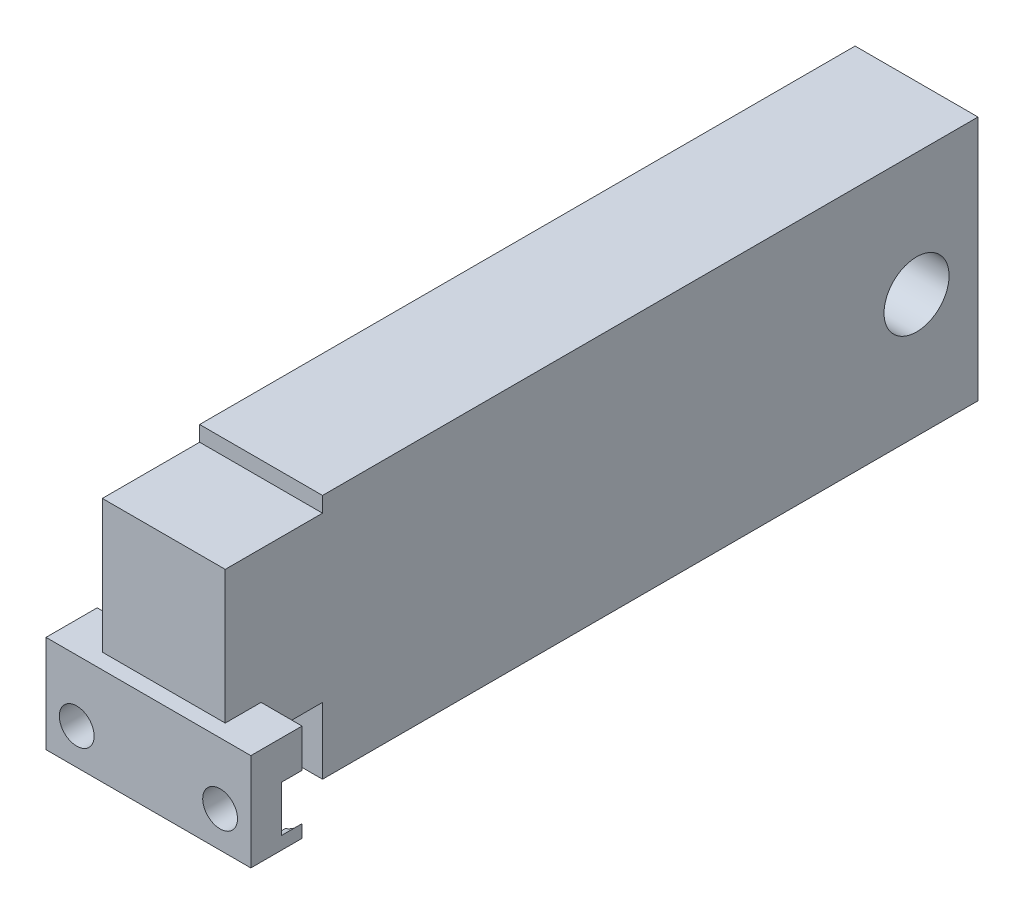
ISO-10303-21;
HEADER;
FILE_DESCRIPTION(('STEP AP214'),'2;1');
FILE_NAME('part.step','',(''),(''),'','','');
FILE_SCHEMA(('AUTOMOTIVE_DESIGN { 1 0 10303 214 1 1 1 1 }'));
ENDSEC;
DATA;
#1=APPLICATION_CONTEXT('core data for automotive mechanical design processes');
#2=APPLICATION_PROTOCOL_DEFINITION('international standard','automotive_design',2000,#1);
#3=PRODUCT_CONTEXT('',#1,'mechanical');
#4=PRODUCT('Part','Part','',(#3));
#5=PRODUCT_RELATED_PRODUCT_CATEGORY('part','',(#4));
#6=PRODUCT_DEFINITION_FORMATION('','',#4);
#7=PRODUCT_DEFINITION_CONTEXT('part definition',#1,'design');
#8=PRODUCT_DEFINITION('design','',#6,#7);
#9=PRODUCT_DEFINITION_SHAPE('','',#8);
#10=(LENGTH_UNIT() NAMED_UNIT(*) SI_UNIT(.MILLI.,.METRE.));
#11=(NAMED_UNIT(*) PLANE_ANGLE_UNIT() SI_UNIT($,.RADIAN.));
#12=(NAMED_UNIT(*) SI_UNIT($,.STERADIAN.) SOLID_ANGLE_UNIT());
#13=UNCERTAINTY_MEASURE_WITH_UNIT(LENGTH_MEASURE(1.E-05),#10,'distance_accuracy_value','');
#14=(GEOMETRIC_REPRESENTATION_CONTEXT(3) GLOBAL_UNCERTAINTY_ASSIGNED_CONTEXT((#13)) GLOBAL_UNIT_ASSIGNED_CONTEXT((#10,
#11,#12)) REPRESENTATION_CONTEXT('',''));
#15=CARTESIAN_POINT('',(0.,0.,0.));
#16=DIRECTION('',(0.,0.,1.));
#17=DIRECTION('',(1.,0.,0.));
#18=AXIS2_PLACEMENT_3D('',#15,#16,#17);
#19=CARTESIAN_POINT('',(0.,0.,-5.));
#20=DIRECTION('',(0.,0.,-1.));
#21=DIRECTION('',(-1.,0.,0.));
#22=AXIS2_PLACEMENT_3D('',#19,#20,#21);
#23=PLANE('',#22);
#24=CARTESIAN_POINT('',(-27.,28.,-5.));
#25=DIRECTION('',(0.,0.,-1.));
#26=DIRECTION('',(-1.,0.,0.));
#27=AXIS2_PLACEMENT_3D('',#24,#25,#26);
#28=CIRCLE('',#27,3.75);
#29=CARTESIAN_POINT('',(-30.,30.25,-5.));
#30=VERTEX_POINT('',#29);
#31=CARTESIAN_POINT('',(-26.,31.6142080737002,-5.));
#32=VERTEX_POINT('',#31);
#33=EDGE_CURVE('E57',#30,#32,#28,.T.);
#34=ORIENTED_EDGE('',*,*,#33,.F.);
#35=DIRECTION('',(0.,-1.,0.));
#36=VECTOR('',#35,1.);
#37=CARTESIAN_POINT('',(-30.,24.5,-5.));
#38=LINE('',#37,#36);
#39=CARTESIAN_POINT('',(-30.,34.,-5.));
#40=VERTEX_POINT('',#39);
#41=EDGE_CURVE('E317',#40,#30,#38,.T.);
#42=ORIENTED_EDGE('',*,*,#41,.F.);
#43=DIRECTION('',(-1.,0.,0.));
#44=VECTOR('',#43,1.);
#45=CARTESIAN_POINT('',(-30.,34.,-5.));
#46=LINE('',#45,#44);
#47=CARTESIAN_POINT('',(-26.,34.,-5.));
#48=VERTEX_POINT('',#47);
#49=EDGE_CURVE('E332',#48,#40,#46,.T.);
#50=ORIENTED_EDGE('',*,*,#49,.F.);
#51=DIRECTION('',(0.,-1.,0.));
#52=VECTOR('',#51,1.);
#53=CARTESIAN_POINT('',(-26.,0.,-5.));
#54=LINE('',#53,#52);
#55=EDGE_CURVE('E293',#48,#32,#54,.T.);
#56=ORIENTED_EDGE('',*,*,#55,.T.);
#57=EDGE_LOOP('',(#34,#42,#50,#56));
#58=FACE_BOUND('',#57,.T.);
#59=ADVANCED_FACE('F41',(#58),#23,.T.);
#60=CARTESIAN_POINT('',(-24.75,31.,-5.));
#61=VERTEX_POINT('',#60);
#62=CARTESIAN_POINT('',(-25.6537087982164,24.5,-5.));
#63=VERTEX_POINT('',#62);
#64=EDGE_CURVE('E239',#61,#63,#28,.T.);
#65=ORIENTED_EDGE('',*,*,#64,.F.);
#66=DIRECTION('',(1.,0.,0.));
#67=VECTOR('',#66,1.);
#68=CARTESIAN_POINT('',(-30.,31.,-5.));
#69=LINE('',#68,#67);
#70=CARTESIAN_POINT('',(-15.25,31.,-5.));
#71=VERTEX_POINT('',#70);
#72=EDGE_CURVE('E231',#61,#71,#69,.T.);
#73=ORIENTED_EDGE('',*,*,#72,.T.);
#74=CARTESIAN_POINT('',(-13.,28.,-5.));
#75=DIRECTION('',(0.,0.,-1.));
#76=DIRECTION('',(-1.,0.,0.));
#77=AXIS2_PLACEMENT_3D('',#74,#75,#76);
#78=CIRCLE('',#77,3.75);
#79=CARTESIAN_POINT('',(-14.3462912017836,24.5,-5.));
#80=VERTEX_POINT('',#79);
#81=EDGE_CURVE('E205',#80,#71,#78,.T.);
#82=ORIENTED_EDGE('',*,*,#81,.F.);
#83=DIRECTION('',(1.,0.,0.));
#84=VECTOR('',#83,1.);
#85=CARTESIAN_POINT('',(-30.,24.5,-5.));
#86=LINE('',#85,#84);
#87=EDGE_CURVE('E330',#63,#80,#86,.T.);
#88=ORIENTED_EDGE('',*,*,#87,.F.);
#89=EDGE_LOOP('',(#65,#73,#82,#88));
#90=FACE_BOUND('',#89,.T.);
#91=ADVANCED_FACE('F236',(#90),#23,.T.);
#92=CARTESIAN_POINT('',(-14.,31.6142080737002,-5.));
#93=VERTEX_POINT('',#92);
#94=CARTESIAN_POINT('',(-10.,30.25,-5.));
#95=VERTEX_POINT('',#94);
#96=EDGE_CURVE('E223',#93,#95,#78,.T.);
#97=ORIENTED_EDGE('',*,*,#96,.F.);
#98=DIRECTION('',(0.,1.,0.));
#99=VECTOR('',#98,1.);
#100=CARTESIAN_POINT('',(-14.,0.,-5.));
#101=LINE('',#100,#99);
#102=CARTESIAN_POINT('',(-14.,34.,-5.));
#103=VERTEX_POINT('',#102);
#104=EDGE_CURVE('E287',#93,#103,#101,.T.);
#105=ORIENTED_EDGE('',*,*,#104,.T.);
#106=CARTESIAN_POINT('',(-10.,34.,-5.));
#107=VERTEX_POINT('',#106);
#108=EDGE_CURVE('E315',#107,#103,#46,.T.);
#109=ORIENTED_EDGE('',*,*,#108,.F.);
#110=DIRECTION('',(0.,1.,0.));
#111=VECTOR('',#110,1.);
#112=CARTESIAN_POINT('',(-10.,24.5,-5.));
#113=LINE('',#112,#111);
#114=EDGE_CURVE('E326',#95,#107,#113,.T.);
#115=ORIENTED_EDGE('',*,*,#114,.F.);
#116=EDGE_LOOP('',(#97,#105,#109,#115));
#117=FACE_BOUND('',#116,.T.);
#118=ADVANCED_FACE('F417',(#117),#23,.T.);
#119=CARTESIAN_POINT('',(-10.,25.75,-5.));
#120=VERTEX_POINT('',#119);
#121=CARTESIAN_POINT('',(-11.6537087982164,24.5,-5.));
#122=VERTEX_POINT('',#121);
#123=EDGE_CURVE('E212',#120,#122,#78,.T.);
#124=ORIENTED_EDGE('',*,*,#123,.F.);
#125=CARTESIAN_POINT('',(-10.,24.5,-5.));
#126=VERTEX_POINT('',#125);
#127=EDGE_CURVE('E327',#126,#120,#113,.T.);
#128=ORIENTED_EDGE('',*,*,#127,.F.);
#129=EDGE_CURVE('E325',#122,#126,#86,.T.);
#130=ORIENTED_EDGE('',*,*,#129,.F.);
#131=EDGE_LOOP('',(#124,#128,#130));
#132=FACE_BOUND('',#131,.T.);
#133=ADVANCED_FACE('F496',(#132),#23,.T.);
#134=CARTESIAN_POINT('',(-27.,28.,0.));
#135=DIRECTION('',(0.,0.,-1.));
#136=DIRECTION('',(-1.,0.,0.));
#137=AXIS2_PLACEMENT_3D('',#134,#135,#136);
#138=CYLINDRICAL_SURFACE('',#137,1.7);
#139=CARTESIAN_POINT('',(-27.,28.,0.));
#140=DIRECTION('',(0.,0.,1.));
#141=DIRECTION('',(1.,0.,0.));
#142=AXIS2_PLACEMENT_3D('',#139,#140,#141);
#143=CIRCLE('',#142,1.7);
#144=CARTESIAN_POINT('',(-25.3,28.,0.));
#145=VERTEX_POINT('',#144);
#146=EDGE_CURVE('E302',#145,#145,#143,.T.);
#147=ORIENTED_EDGE('',*,*,#146,.T.);
#148=EDGE_LOOP('',(#147));
#149=FACE_BOUND('',#148,.T.);
#150=CARTESIAN_POINT('',(-27.,28.,-3.));
#151=DIRECTION('',(0.,0.,-1.));
#152=DIRECTION('',(-1.,0.,0.));
#153=AXIS2_PLACEMENT_3D('',#150,#151,#152);
#154=CIRCLE('',#153,1.7);
#155=CARTESIAN_POINT('',(-28.7,28.,-3.));
#156=VERTEX_POINT('',#155);
#157=EDGE_CURVE('E453',#156,#156,#154,.T.);
#158=ORIENTED_EDGE('',*,*,#157,.T.);
#159=EDGE_LOOP('',(#158));
#160=FACE_BOUND('',#159,.T.);
#161=ADVANCED_FACE('F530',(#149,#160),#138,.F.);
#162=CARTESIAN_POINT('',(-13.,28.,0.));
#163=DIRECTION('',(0.,0.,-1.));
#164=DIRECTION('',(-1.,0.,0.));
#165=AXIS2_PLACEMENT_3D('',#162,#163,#164);
#166=CYLINDRICAL_SURFACE('',#165,1.7);
#167=CARTESIAN_POINT('',(-13.,28.,0.));
#168=DIRECTION('',(0.,0.,1.));
#169=DIRECTION('',(1.,0.,0.));
#170=AXIS2_PLACEMENT_3D('',#167,#168,#169);
#171=CIRCLE('',#170,1.7);
#172=CARTESIAN_POINT('',(-11.3,28.,0.));
#173=VERTEX_POINT('',#172);
#174=EDGE_CURVE('E301',#173,#173,#171,.T.);
#175=ORIENTED_EDGE('',*,*,#174,.T.);
#176=EDGE_LOOP('',(#175));
#177=FACE_BOUND('',#176,.T.);
#178=CARTESIAN_POINT('',(-13.,28.,-3.));
#179=DIRECTION('',(0.,0.,-1.));
#180=DIRECTION('',(-1.,0.,0.));
#181=AXIS2_PLACEMENT_3D('',#178,#179,#180);
#182=CIRCLE('',#181,1.7);
#183=CARTESIAN_POINT('',(-14.7,28.,-3.));
#184=VERTEX_POINT('',#183);
#185=EDGE_CURVE('E448',#184,#184,#182,.T.);
#186=ORIENTED_EDGE('',*,*,#185,.T.);
#187=EDGE_LOOP('',(#186));
#188=FACE_BOUND('',#187,.T.);
#189=ADVANCED_FACE('F527',(#177,#188),#166,.F.);
#190=CARTESIAN_POINT('',(-30.,24.5,0.));
#191=DIRECTION('',(0.,1.,0.));
#192=DIRECTION('',(0.,0.,1.));
#193=AXIS2_PLACEMENT_3D('',#190,#191,#192);
#194=PLANE('',#193);
#195=DIRECTION('',(-1.,0.,0.));
#196=VECTOR('',#195,1.);
#197=CARTESIAN_POINT('',(-30.,24.5,-3.));
#198=LINE('',#197,#196);
#199=CARTESIAN_POINT('',(-25.6537087982164,24.5,-3.));
#200=VERTEX_POINT('',#199);
#201=CARTESIAN_POINT('',(-28.3462912017836,24.5,-3.));
#202=VERTEX_POINT('',#201);
#203=EDGE_CURVE('E242',#200,#202,#198,.T.);
#204=ORIENTED_EDGE('',*,*,#203,.F.);
#205=DIRECTION('',(0.,0.,-1.));
#206=VECTOR('',#205,1.);
#207=CARTESIAN_POINT('',(-25.6537087982164,24.5,-3.));
#208=LINE('',#207,#206);
#209=EDGE_CURVE('E446',#200,#63,#208,.T.);
#210=ORIENTED_EDGE('',*,*,#209,.T.);
#211=ORIENTED_EDGE('',*,*,#87,.T.);
#212=DIRECTION('',(0.,0.,-1.));
#213=VECTOR('',#212,1.);
#214=CARTESIAN_POINT('',(-14.3462912017836,24.5,-3.));
#215=LINE('',#214,#213);
#216=CARTESIAN_POINT('',(-14.3462912017836,24.5,-3.));
#217=VERTEX_POINT('',#216);
#218=EDGE_CURVE('E207',#80,#217,#215,.F.);
#219=ORIENTED_EDGE('',*,*,#218,.T.);
#220=DIRECTION('',(-1.,0.,0.));
#221=VECTOR('',#220,1.);
#222=CARTESIAN_POINT('',(-30.,24.5,-3.));
#223=LINE('',#222,#221);
#224=CARTESIAN_POINT('',(-11.6537087982164,24.5,-3.));
#225=VERTEX_POINT('',#224);
#226=EDGE_CURVE('E455',#225,#217,#223,.T.);
#227=ORIENTED_EDGE('',*,*,#226,.F.);
#228=DIRECTION('',(0.,0.,-1.));
#229=VECTOR('',#228,1.);
#230=CARTESIAN_POINT('',(-11.6537087982164,24.5,-3.));
#231=LINE('',#230,#229);
#232=EDGE_CURVE('E432',#225,#122,#231,.T.);
#233=ORIENTED_EDGE('',*,*,#232,.T.);
#234=ORIENTED_EDGE('',*,*,#129,.T.);
#235=DIRECTION('',(0.,0.,-1.));
#236=VECTOR('',#235,1.);
#237=CARTESIAN_POINT('',(-10.,24.5,0.));
#238=LINE('',#237,#236);
#239=CARTESIAN_POINT('',(-10.,24.5,0.));
#240=VERTEX_POINT('',#239);
#241=EDGE_CURVE('E338',#240,#126,#238,.T.);
#242=ORIENTED_EDGE('',*,*,#241,.F.);
#243=DIRECTION('',(1.,0.,0.));
#244=VECTOR('',#243,1.);
#245=CARTESIAN_POINT('',(-30.,24.5,0.));
#246=LINE('',#245,#244);
#247=CARTESIAN_POINT('',(-30.,24.5,0.));
#248=VERTEX_POINT('',#247);
#249=EDGE_CURVE('E313',#248,#240,#246,.T.);
#250=ORIENTED_EDGE('',*,*,#249,.F.);
#251=DIRECTION('',(0.,0.,-1.));
#252=VECTOR('',#251,1.);
#253=CARTESIAN_POINT('',(-30.,24.5,0.));
#254=LINE('',#253,#252);
#255=CARTESIAN_POINT('',(-30.,24.5,-5.));
#256=VERTEX_POINT('',#255);
#257=EDGE_CURVE('E345',#248,#256,#254,.T.);
#258=ORIENTED_EDGE('',*,*,#257,.T.);
#259=CARTESIAN_POINT('',(-28.3462912017836,24.5,-5.));
#260=VERTEX_POINT('',#259);
#261=EDGE_CURVE('E323',#256,#260,#86,.T.);
#262=ORIENTED_EDGE('',*,*,#261,.T.);
#263=DIRECTION('',(0.,0.,-1.));
#264=VECTOR('',#263,1.);
#265=CARTESIAN_POINT('',(-28.3462912017836,24.5,-3.));
#266=LINE('',#265,#264);
#267=EDGE_CURVE('E444',#260,#202,#266,.F.);
#268=ORIENTED_EDGE('',*,*,#267,.T.);
#269=EDGE_LOOP('',(#204,#210,#211,#219,#227,#233,#234,#242,#250,#258,#262,#268));
#270=FACE_BOUND('',#269,.T.);
#271=ADVANCED_FACE('F469',(#270),#194,.F.);
#272=CARTESIAN_POINT('',(-30.,25.75,-5.));
#273=VERTEX_POINT('',#272);
#274=EDGE_CURVE('E221',#260,#273,#28,.T.);
#275=ORIENTED_EDGE('',*,*,#274,.F.);
#276=ORIENTED_EDGE('',*,*,#261,.F.);
#277=EDGE_CURVE('E307',#273,#256,#38,.T.);
#278=ORIENTED_EDGE('',*,*,#277,.F.);
#279=EDGE_LOOP('',(#275,#276,#278));
#280=FACE_BOUND('',#279,.T.);
#281=ADVANCED_FACE('F474',(#280),#23,.T.);
#282=CARTESIAN_POINT('',(-30.,34.,0.));
#283=DIRECTION('',(0.,-1.,0.));
#284=DIRECTION('',(0.,0.,-1.));
#285=AXIS2_PLACEMENT_3D('',#282,#283,#284);
#286=PLANE('',#285);
#287=DIRECTION('',(0.,0.,1.));
#288=VECTOR('',#287,1.);
#289=CARTESIAN_POINT('',(-26.,34.,0.));
#290=LINE('',#289,#288);
#291=CARTESIAN_POINT('',(-26.,34.,-1.5));
#292=VERTEX_POINT('',#291);
#293=EDGE_CURVE('E297',#48,#292,#290,.T.);
#294=ORIENTED_EDGE('',*,*,#293,.F.);
#295=ORIENTED_EDGE('',*,*,#49,.T.);
#296=DIRECTION('',(0.,0.,-1.));
#297=VECTOR('',#296,1.);
#298=CARTESIAN_POINT('',(-30.,34.,0.));
#299=LINE('',#298,#297);
#300=CARTESIAN_POINT('',(-30.,34.,0.));
#301=VERTEX_POINT('',#300);
#302=EDGE_CURVE('E318',#301,#40,#299,.T.);
#303=ORIENTED_EDGE('',*,*,#302,.F.);
#304=DIRECTION('',(-1.,0.,0.));
#305=VECTOR('',#304,1.);
#306=CARTESIAN_POINT('',(-30.,34.,0.));
#307=LINE('',#306,#305);
#308=CARTESIAN_POINT('',(-10.,34.,0.));
#309=VERTEX_POINT('',#308);
#310=EDGE_CURVE('E316',#309,#301,#307,.T.);
#311=ORIENTED_EDGE('',*,*,#310,.F.);
#312=DIRECTION('',(0.,0.,-1.));
#313=VECTOR('',#312,1.);
#314=CARTESIAN_POINT('',(-10.,34.,0.));
#315=LINE('',#314,#313);
#316=EDGE_CURVE('E336',#309,#107,#315,.T.);
#317=ORIENTED_EDGE('',*,*,#316,.T.);
#318=ORIENTED_EDGE('',*,*,#108,.T.);
#319=DIRECTION('',(0.,0.,-1.));
#320=VECTOR('',#319,1.);
#321=CARTESIAN_POINT('',(-14.,34.,0.));
#322=LINE('',#321,#320);
#323=CARTESIAN_POINT('',(-14.,34.,-1.5));
#324=VERTEX_POINT('',#323);
#325=EDGE_CURVE('E295',#324,#103,#322,.T.);
#326=ORIENTED_EDGE('',*,*,#325,.F.);
#327=DIRECTION('',(1.,0.,0.));
#328=VECTOR('',#327,1.);
#329=CARTESIAN_POINT('',(-30.,34.,-1.5));
#330=LINE('',#329,#328);
#331=EDGE_CURVE('E290',#292,#324,#330,.T.);
#332=ORIENTED_EDGE('',*,*,#331,.F.);
#333=EDGE_LOOP('',(#294,#295,#303,#311,#317,#318,#326,#332));
#334=FACE_BOUND('',#333,.T.);
#335=ADVANCED_FACE('F411',(#334),#286,.F.);
#336=CARTESIAN_POINT('',(0.,0.,0.));
#337=DIRECTION('',(0.,0.,-1.));
#338=DIRECTION('',(-1.,0.,0.));
#339=AXIS2_PLACEMENT_3D('',#336,#337,#338);
#340=PLANE('',#339);
#341=DIRECTION('',(0.,-1.,0.));
#342=VECTOR('',#341,1.);
#343=CARTESIAN_POINT('',(-30.,24.5,0.));
#344=LINE('',#343,#342);
#345=EDGE_CURVE('E306',#301,#248,#344,.T.);
#346=ORIENTED_EDGE('',*,*,#345,.T.);
#347=ORIENTED_EDGE('',*,*,#249,.T.);
#348=DIRECTION('',(0.,1.,0.));
#349=VECTOR('',#348,1.);
#350=CARTESIAN_POINT('',(-10.,24.5,0.));
#351=LINE('',#350,#349);
#352=EDGE_CURVE('E314',#240,#309,#351,.T.);
#353=ORIENTED_EDGE('',*,*,#352,.T.);
#354=ORIENTED_EDGE('',*,*,#310,.T.);
#355=EDGE_LOOP('',(#346,#347,#353,#354));
#356=FACE_BOUND('',#355,.T.);
#357=ORIENTED_EDGE('',*,*,#146,.F.);
#358=EDGE_LOOP('',(#357));
#359=FACE_BOUND('',#358,.T.);
#360=ORIENTED_EDGE('',*,*,#174,.F.);
#361=EDGE_LOOP('',(#360));
#362=FACE_BOUND('',#361,.T.);
#363=ADVANCED_FACE('F490',(#356,#359,#362),#340,.F.);
#364=CARTESIAN_POINT('',(-30.,24.5,0.));
#365=DIRECTION('',(1.,0.,0.));
#366=DIRECTION('',(0.,0.,-1.));
#367=AXIS2_PLACEMENT_3D('',#364,#365,#366);
#368=PLANE('',#367);
#369=DIRECTION('',(0.,1.,0.));
#370=VECTOR('',#369,1.);
#371=CARTESIAN_POINT('',(-30.,24.5,-3.));
#372=LINE('',#371,#370);
#373=CARTESIAN_POINT('',(-30.,25.75,-3.));
#374=VERTEX_POINT('',#373);
#375=CARTESIAN_POINT('',(-30.,30.25,-3.));
#376=VERTEX_POINT('',#375);
#377=EDGE_CURVE('E11',#374,#376,#372,.T.);
#378=ORIENTED_EDGE('',*,*,#377,.F.);
#379=DIRECTION('',(0.,0.,-1.));
#380=VECTOR('',#379,1.);
#381=CARTESIAN_POINT('',(-30.,25.75,-3.));
#382=LINE('',#381,#380);
#383=EDGE_CURVE('E439',#374,#273,#382,.T.);
#384=ORIENTED_EDGE('',*,*,#383,.T.);
#385=ORIENTED_EDGE('',*,*,#277,.T.);
#386=ORIENTED_EDGE('',*,*,#257,.F.);
#387=ORIENTED_EDGE('',*,*,#345,.F.);
#388=ORIENTED_EDGE('',*,*,#302,.T.);
#389=ORIENTED_EDGE('',*,*,#41,.T.);
#390=DIRECTION('',(0.,0.,-1.));
#391=VECTOR('',#390,1.);
#392=CARTESIAN_POINT('',(-30.,30.25,-3.));
#393=LINE('',#392,#391);
#394=EDGE_CURVE('E440',#30,#376,#393,.F.);
#395=ORIENTED_EDGE('',*,*,#394,.T.);
#396=EDGE_LOOP('',(#378,#384,#385,#386,#387,#388,#389,#395));
#397=FACE_BOUND('',#396,.T.);
#398=ADVANCED_FACE('F43',(#397),#368,.F.);
#399=DIRECTION('',(0.,0.,-1.));
#400=VECTOR('',#399,1.);
#401=CARTESIAN_POINT('',(-14.,24.5,-1.5));
#402=LINE('',#401,#400);
#403=CARTESIAN_POINT('',(-14.,24.5,-11.));
#404=VERTEX_POINT('',#403);
#405=CARTESIAN_POINT('',(-14.,24.5,-75.));
#406=VERTEX_POINT('',#405);
#407=EDGE_CURVE('E361',#404,#406,#402,.T.);
#408=ORIENTED_EDGE('',*,*,#407,.F.);
#409=DIRECTION('',(-1.,0.,0.));
#410=VECTOR('',#409,1.);
#411=CARTESIAN_POINT('',(-30.,24.5,-11.));
#412=LINE('',#411,#410);
#413=CARTESIAN_POINT('',(-26.,24.5,-11.));
#414=VERTEX_POINT('',#413);
#415=EDGE_CURVE('E63',#404,#414,#412,.T.);
#416=ORIENTED_EDGE('',*,*,#415,.T.);
#417=DIRECTION('',(0.,0.,-1.));
#418=VECTOR('',#417,1.);
#419=CARTESIAN_POINT('',(-26.,24.5,-1.5));
#420=LINE('',#419,#418);
#421=CARTESIAN_POINT('',(-26.,24.5,-75.));
#422=VERTEX_POINT('',#421);
#423=EDGE_CURVE('E289',#414,#422,#420,.T.);
#424=ORIENTED_EDGE('',*,*,#423,.T.);
#425=DIRECTION('',(1.,0.,0.));
#426=VECTOR('',#425,1.);
#427=CARTESIAN_POINT('',(-26.,24.5,-75.));
#428=LINE('',#427,#426);
#429=EDGE_CURVE('E269',#422,#406,#428,.T.);
#430=ORIENTED_EDGE('',*,*,#429,.T.);
#431=EDGE_LOOP('',(#408,#416,#424,#430));
#432=FACE_BOUND('',#431,.T.);
#433=ADVANCED_FACE('F381',(#432),#194,.F.);
#434=CARTESIAN_POINT('',(-10.,24.5,0.));
#435=DIRECTION('',(-1.,0.,0.));
#436=DIRECTION('',(0.,0.,1.));
#437=AXIS2_PLACEMENT_3D('',#434,#435,#436);
#438=PLANE('',#437);
#439=DIRECTION('',(0.,-1.,0.));
#440=VECTOR('',#439,1.);
#441=CARTESIAN_POINT('',(-10.,24.5,-3.));
#442=LINE('',#441,#440);
#443=CARTESIAN_POINT('',(-10.,30.25,-3.));
#444=VERTEX_POINT('',#443);
#445=CARTESIAN_POINT('',(-10.,25.75,-3.));
#446=VERTEX_POINT('',#445);
#447=EDGE_CURVE('E47',#444,#446,#442,.T.);
#448=ORIENTED_EDGE('',*,*,#447,.F.);
#449=DIRECTION('',(0.,0.,-1.));
#450=VECTOR('',#449,1.);
#451=CARTESIAN_POINT('',(-10.,30.25,-3.));
#452=LINE('',#451,#450);
#453=EDGE_CURVE('E431',#444,#95,#452,.T.);
#454=ORIENTED_EDGE('',*,*,#453,.T.);
#455=ORIENTED_EDGE('',*,*,#114,.T.);
#456=ORIENTED_EDGE('',*,*,#316,.F.);
#457=ORIENTED_EDGE('',*,*,#352,.F.);
#458=ORIENTED_EDGE('',*,*,#241,.T.);
#459=ORIENTED_EDGE('',*,*,#127,.T.);
#460=DIRECTION('',(0.,0.,-1.));
#461=VECTOR('',#460,1.);
#462=CARTESIAN_POINT('',(-10.,25.75,-3.));
#463=LINE('',#462,#461);
#464=EDGE_CURVE('E430',#120,#446,#463,.F.);
#465=ORIENTED_EDGE('',*,*,#464,.T.);
#466=EDGE_LOOP('',(#448,#454,#455,#456,#457,#458,#459,#465));
#467=FACE_BOUND('',#466,.T.);
#468=ADVANCED_FACE('F495',(#467),#438,.F.);
#469=CARTESIAN_POINT('',(-26.,24.5,-1.5));
#470=DIRECTION('',(1.,0.,0.));
#471=DIRECTION('',(0.,0.,-1.));
#472=AXIS2_PLACEMENT_3D('',#469,#470,#471);
#473=PLANE('',#472);
#474=DIRECTION('',(0.,1.,0.));
#475=VECTOR('',#474,1.);
#476=CARTESIAN_POINT('',(-26.,24.5,-11.));
#477=LINE('',#476,#475);
#478=CARTESIAN_POINT('',(-26.,31.,-11.));
#479=VERTEX_POINT('',#478);
#480=EDGE_CURVE('E261',#414,#479,#477,.T.);
#481=ORIENTED_EDGE('',*,*,#480,.T.);
#482=DIRECTION('',(0.,0.,1.));
#483=VECTOR('',#482,1.);
#484=CARTESIAN_POINT('',(-26.,31.,-1.5));
#485=LINE('',#484,#483);
#486=CARTESIAN_POINT('',(-26.,31.,-5.));
#487=VERTEX_POINT('',#486);
#488=EDGE_CURVE('E262',#479,#487,#485,.T.);
#489=ORIENTED_EDGE('',*,*,#488,.T.);
#490=DIRECTION('',(0.,1.,0.));
#491=VECTOR('',#490,1.);
#492=CARTESIAN_POINT('',(-26.,24.5,-5.));
#493=LINE('',#492,#491);
#494=EDGE_CURVE('E424',#487,#32,#493,.T.);
#495=ORIENTED_EDGE('',*,*,#494,.T.);
#496=ORIENTED_EDGE('',*,*,#55,.F.);
#497=ORIENTED_EDGE('',*,*,#293,.T.);
#498=DIRECTION('',(0.,-1.,0.));
#499=VECTOR('',#498,1.);
#500=CARTESIAN_POINT('',(-26.,24.5,-1.5));
#501=LINE('',#500,#499);
#502=CARTESIAN_POINT('',(-26.,47.,-1.5));
#503=VERTEX_POINT('',#502);
#504=EDGE_CURVE('E278',#503,#292,#501,.T.);
#505=ORIENTED_EDGE('',*,*,#504,.F.);
#506=DIRECTION('',(0.,0.,-1.));
#507=VECTOR('',#506,1.);
#508=CARTESIAN_POINT('',(-26.,47.,-1.5));
#509=LINE('',#508,#507);
#510=CARTESIAN_POINT('',(-26.,47.,-11.));
#511=VERTEX_POINT('',#510);
#512=EDGE_CURVE('E253',#503,#511,#509,.T.);
#513=ORIENTED_EDGE('',*,*,#512,.T.);
#514=DIRECTION('',(0.,1.,0.));
#515=VECTOR('',#514,1.);
#516=CARTESIAN_POINT('',(-26.,24.5,-11.));
#517=LINE('',#516,#515);
#518=CARTESIAN_POINT('',(-26.,48.5,-11.));
#519=VERTEX_POINT('',#518);
#520=EDGE_CURVE('E260',#511,#519,#517,.T.);
#521=ORIENTED_EDGE('',*,*,#520,.T.);
#522=DIRECTION('',(0.,0.,-1.));
#523=VECTOR('',#522,1.);
#524=CARTESIAN_POINT('',(-26.,48.5,-1.5));
#525=LINE('',#524,#523);
#526=CARTESIAN_POINT('',(-26.,48.5,-75.));
#527=VERTEX_POINT('',#526);
#528=EDGE_CURVE('E286',#519,#527,#525,.T.);
#529=ORIENTED_EDGE('',*,*,#528,.T.);
#530=DIRECTION('',(0.,-1.,0.));
#531=VECTOR('',#530,1.);
#532=CARTESIAN_POINT('',(-26.,24.5,-75.));
#533=LINE('',#532,#531);
#534=EDGE_CURVE('E270',#527,#422,#533,.T.);
#535=ORIENTED_EDGE('',*,*,#534,.T.);
#536=ORIENTED_EDGE('',*,*,#423,.F.);
#537=EDGE_LOOP('',(#481,#489,#495,#496,#497,#505,#513,#521,#529,#535,#536));
#538=FACE_BOUND('',#537,.T.);
#539=CARTESIAN_POINT('',(-26.,36.5,-69.));
#540=DIRECTION('',(1.,0.,0.));
#541=DIRECTION('',(0.,0.,-1.));
#542=AXIS2_PLACEMENT_3D('',#539,#540,#541);
#543=CIRCLE('',#542,3.175);
#544=CARTESIAN_POINT('',(-26.,36.5,-72.175));
#545=VERTEX_POINT('',#544);
#546=EDGE_CURVE('E282',#545,#545,#543,.T.);
#547=ORIENTED_EDGE('',*,*,#546,.T.);
#548=EDGE_LOOP('',(#547));
#549=FACE_BOUND('',#548,.T.);
#550=ADVANCED_FACE('F400',(#538,#549),#473,.F.);
#551=CARTESIAN_POINT('',(-14.,24.5,-1.5));
#552=DIRECTION('',(-1.,0.,0.));
#553=DIRECTION('',(0.,0.,1.));
#554=AXIS2_PLACEMENT_3D('',#551,#552,#553);
#555=PLANE('',#554);
#556=CARTESIAN_POINT('',(-14.,31.,-5.));
#557=VERTEX_POINT('',#556);
#558=EDGE_CURVE('E224',#557,#93,#101,.T.);
#559=ORIENTED_EDGE('',*,*,#558,.F.);
#560=DIRECTION('',(0.,0.,-1.));
#561=VECTOR('',#560,1.);
#562=CARTESIAN_POINT('',(-14.,31.,-1.5));
#563=LINE('',#562,#561);
#564=CARTESIAN_POINT('',(-14.,31.,-11.));
#565=VERTEX_POINT('',#564);
#566=EDGE_CURVE('E233',#557,#565,#563,.T.);
#567=ORIENTED_EDGE('',*,*,#566,.T.);
#568=DIRECTION('',(0.,-1.,0.));
#569=VECTOR('',#568,1.);
#570=CARTESIAN_POINT('',(-14.,24.5,-11.));
#571=LINE('',#570,#569);
#572=EDGE_CURVE('E362',#565,#404,#571,.T.);
#573=ORIENTED_EDGE('',*,*,#572,.T.);
#574=ORIENTED_EDGE('',*,*,#407,.T.);
#575=DIRECTION('',(0.,1.,0.));
#576=VECTOR('',#575,1.);
#577=CARTESIAN_POINT('',(-14.,24.5,-75.));
#578=LINE('',#577,#576);
#579=CARTESIAN_POINT('',(-14.,48.5,-75.));
#580=VERTEX_POINT('',#579);
#581=EDGE_CURVE('E272',#406,#580,#578,.T.);
#582=ORIENTED_EDGE('',*,*,#581,.T.);
#583=DIRECTION('',(0.,0.,-1.));
#584=VECTOR('',#583,1.);
#585=CARTESIAN_POINT('',(-14.,48.5,-1.5));
#586=LINE('',#585,#584);
#587=CARTESIAN_POINT('',(-14.,48.5,-11.));
#588=VERTEX_POINT('',#587);
#589=EDGE_CURVE('E360',#588,#580,#586,.T.);
#590=ORIENTED_EDGE('',*,*,#589,.F.);
#591=DIRECTION('',(0.,-1.,0.));
#592=VECTOR('',#591,1.);
#593=CARTESIAN_POINT('',(-14.,24.5,-11.));
#594=LINE('',#593,#592);
#595=CARTESIAN_POINT('',(-14.,47.,-11.));
#596=VERTEX_POINT('',#595);
#597=EDGE_CURVE('E255',#588,#596,#594,.T.);
#598=ORIENTED_EDGE('',*,*,#597,.T.);
#599=DIRECTION('',(0.,0.,1.));
#600=VECTOR('',#599,1.);
#601=CARTESIAN_POINT('',(-14.,47.,-1.5));
#602=LINE('',#601,#600);
#603=CARTESIAN_POINT('',(-14.,47.,-1.5));
#604=VERTEX_POINT('',#603);
#605=EDGE_CURVE('E238',#596,#604,#602,.T.);
#606=ORIENTED_EDGE('',*,*,#605,.T.);
#607=DIRECTION('',(0.,1.,0.));
#608=VECTOR('',#607,1.);
#609=CARTESIAN_POINT('',(-14.,24.5,-1.5));
#610=LINE('',#609,#608);
#611=EDGE_CURVE('E285',#324,#604,#610,.T.);
#612=ORIENTED_EDGE('',*,*,#611,.F.);
#613=ORIENTED_EDGE('',*,*,#325,.T.);
#614=ORIENTED_EDGE('',*,*,#104,.F.);
#615=EDGE_LOOP('',(#559,#567,#573,#574,#582,#590,#598,#606,#612,#613,#614));
#616=FACE_BOUND('',#615,.T.);
#617=CARTESIAN_POINT('',(-14.,36.5,-69.));
#618=DIRECTION('',(-1.,0.,0.));
#619=DIRECTION('',(0.,0.,1.));
#620=AXIS2_PLACEMENT_3D('',#617,#618,#619);
#621=CIRCLE('',#620,3.175);
#622=CARTESIAN_POINT('',(-14.,36.5,-65.825));
#623=VERTEX_POINT('',#622);
#624=EDGE_CURVE('E276',#623,#623,#621,.T.);
#625=ORIENTED_EDGE('',*,*,#624,.T.);
#626=EDGE_LOOP('',(#625));
#627=FACE_BOUND('',#626,.T.);
#628=ADVANCED_FACE('F380',(#616,#627),#555,.F.);
#629=CARTESIAN_POINT('',(-26.,48.5,-1.5));
#630=DIRECTION('',(0.,-1.,0.));
#631=DIRECTION('',(0.,0.,-1.));
#632=AXIS2_PLACEMENT_3D('',#629,#630,#631);
#633=PLANE('',#632);
#634=ORIENTED_EDGE('',*,*,#528,.F.);
#635=DIRECTION('',(1.,0.,0.));
#636=VECTOR('',#635,1.);
#637=CARTESIAN_POINT('',(-26.,48.5,-11.));
#638=LINE('',#637,#636);
#639=EDGE_CURVE('E357',#519,#588,#638,.T.);
#640=ORIENTED_EDGE('',*,*,#639,.T.);
#641=ORIENTED_EDGE('',*,*,#589,.T.);
#642=DIRECTION('',(-1.,0.,0.));
#643=VECTOR('',#642,1.);
#644=CARTESIAN_POINT('',(-26.,48.5,-75.));
#645=LINE('',#644,#643);
#646=EDGE_CURVE('E277',#580,#527,#645,.T.);
#647=ORIENTED_EDGE('',*,*,#646,.T.);
#648=EDGE_LOOP('',(#634,#640,#641,#647));
#649=FACE_BOUND('',#648,.T.);
#650=ADVANCED_FACE('F395',(#649),#633,.F.);
#651=CARTESIAN_POINT('',(0.,0.,-1.5));
#652=DIRECTION('',(0.,0.,-1.));
#653=DIRECTION('',(-1.,0.,0.));
#654=AXIS2_PLACEMENT_3D('',#651,#652,#653);
#655=PLANE('',#654);
#656=ORIENTED_EDGE('',*,*,#611,.T.);
#657=DIRECTION('',(-1.,0.,0.));
#658=VECTOR('',#657,1.);
#659=CARTESIAN_POINT('',(0.,47.,-1.5));
#660=LINE('',#659,#658);
#661=EDGE_CURVE('E344',#604,#503,#660,.T.);
#662=ORIENTED_EDGE('',*,*,#661,.T.);
#663=ORIENTED_EDGE('',*,*,#504,.T.);
#664=ORIENTED_EDGE('',*,*,#331,.T.);
#665=EDGE_LOOP('',(#656,#662,#663,#664));
#666=FACE_BOUND('',#665,.T.);
#667=ADVANCED_FACE('F404',(#666),#655,.F.);
#668=CARTESIAN_POINT('',(-30.,36.5,-69.));
#669=DIRECTION('',(1.,0.,0.));
#670=DIRECTION('',(0.,0.,-1.));
#671=AXIS2_PLACEMENT_3D('',#668,#669,#670);
#672=CYLINDRICAL_SURFACE('',#671,3.175);
#673=ORIENTED_EDGE('',*,*,#624,.F.);
#674=EDGE_LOOP('',(#673));
#675=FACE_BOUND('',#674,.T.);
#676=ORIENTED_EDGE('',*,*,#546,.F.);
#677=EDGE_LOOP('',(#676));
#678=FACE_BOUND('',#677,.T.);
#679=ADVANCED_FACE('F618',(#675,#678),#672,.F.);
#680=CARTESIAN_POINT('',(0.,0.,-75.));
#681=DIRECTION('',(0.,0.,-1.));
#682=DIRECTION('',(-1.,0.,0.));
#683=AXIS2_PLACEMENT_3D('',#680,#681,#682);
#684=PLANE('',#683);
#685=ORIENTED_EDGE('',*,*,#534,.F.);
#686=ORIENTED_EDGE('',*,*,#646,.F.);
#687=ORIENTED_EDGE('',*,*,#581,.F.);
#688=ORIENTED_EDGE('',*,*,#429,.F.);
#689=EDGE_LOOP('',(#685,#686,#687,#688));
#690=FACE_BOUND('',#689,.T.);
#691=ADVANCED_FACE('F389',(#690),#684,.T.);
#692=CARTESIAN_POINT('',(-30.,47.,-11.));
#693=DIRECTION('',(0.,0.,-1.));
#694=DIRECTION('',(-1.,0.,0.));
#695=AXIS2_PLACEMENT_3D('',#692,#693,#694);
#696=PLANE('',#695);
#697=DIRECTION('',(1.,0.,0.));
#698=VECTOR('',#697,1.);
#699=CARTESIAN_POINT('',(-30.,47.,-11.));
#700=LINE('',#699,#698);
#701=EDGE_CURVE('E246',#511,#596,#700,.T.);
#702=ORIENTED_EDGE('',*,*,#701,.T.);
#703=ORIENTED_EDGE('',*,*,#597,.F.);
#704=ORIENTED_EDGE('',*,*,#639,.F.);
#705=ORIENTED_EDGE('',*,*,#520,.F.);
#706=EDGE_LOOP('',(#702,#703,#704,#705));
#707=FACE_BOUND('',#706,.T.);
#708=ADVANCED_FACE('F393',(#707),#696,.F.);
#709=CARTESIAN_POINT('',(-30.,47.,-1.));
#710=DIRECTION('',(0.,-1.,0.));
#711=DIRECTION('',(0.,0.,-1.));
#712=AXIS2_PLACEMENT_3D('',#709,#710,#711);
#713=PLANE('',#712);
#714=ORIENTED_EDGE('',*,*,#661,.F.);
#715=ORIENTED_EDGE('',*,*,#605,.F.);
#716=ORIENTED_EDGE('',*,*,#701,.F.);
#717=ORIENTED_EDGE('',*,*,#512,.F.);
#718=EDGE_LOOP('',(#714,#715,#716,#717));
#719=FACE_BOUND('',#718,.T.);
#720=ADVANCED_FACE('F405',(#719),#713,.F.);
#721=CARTESIAN_POINT('',(-30.,31.,-11.));
#722=DIRECTION('',(0.,1.,0.));
#723=DIRECTION('',(0.,0.,1.));
#724=AXIS2_PLACEMENT_3D('',#721,#722,#723);
#725=PLANE('',#724);
#726=DIRECTION('',(1.,0.,0.));
#727=VECTOR('',#726,1.);
#728=CARTESIAN_POINT('',(-30.,31.,-11.));
#729=LINE('',#728,#727);
#730=EDGE_CURVE('E232',#479,#565,#729,.T.);
#731=ORIENTED_EDGE('',*,*,#730,.T.);
#732=ORIENTED_EDGE('',*,*,#566,.F.);
#733=EDGE_CURVE('E219',#71,#557,#69,.T.);
#734=ORIENTED_EDGE('',*,*,#733,.F.);
#735=ORIENTED_EDGE('',*,*,#72,.F.);
#736=EDGE_CURVE('E237',#487,#61,#69,.T.);
#737=ORIENTED_EDGE('',*,*,#736,.F.);
#738=ORIENTED_EDGE('',*,*,#488,.F.);
#739=EDGE_LOOP('',(#731,#732,#734,#735,#737,#738));
#740=FACE_BOUND('',#739,.T.);
#741=ADVANCED_FACE('F228',(#740),#725,.F.);
#742=CARTESIAN_POINT('',(-30.,24.,-11.));
#743=DIRECTION('',(0.,0.,-1.));
#744=DIRECTION('',(-1.,0.,0.));
#745=AXIS2_PLACEMENT_3D('',#742,#743,#744);
#746=PLANE('',#745);
#747=ORIENTED_EDGE('',*,*,#415,.F.);
#748=ORIENTED_EDGE('',*,*,#572,.F.);
#749=ORIENTED_EDGE('',*,*,#730,.F.);
#750=ORIENTED_EDGE('',*,*,#480,.F.);
#751=EDGE_LOOP('',(#747,#748,#749,#750));
#752=FACE_BOUND('',#751,.T.);
#753=ADVANCED_FACE('F508',(#752),#746,.F.);
#754=CARTESIAN_POINT('',(-13.,28.,-3.));
#755=DIRECTION('',(0.,0.,-1.));
#756=DIRECTION('',(-1.,0.,0.));
#757=AXIS2_PLACEMENT_3D('',#754,#755,#756);
#758=PLANE('',#757);
#759=ORIENTED_EDGE('',*,*,#185,.F.);
#760=EDGE_LOOP('',(#759));
#761=FACE_BOUND('',#760,.T.);
#762=ORIENTED_EDGE('',*,*,#226,.T.);
#763=CARTESIAN_POINT('',(-13.,28.,-3.));
#764=DIRECTION('',(0.,0.,-1.));
#765=DIRECTION('',(-1.,0.,0.));
#766=AXIS2_PLACEMENT_3D('',#763,#764,#765);
#767=CIRCLE('',#766,3.75);
#768=EDGE_CURVE('E425',#217,#444,#767,.T.);
#769=ORIENTED_EDGE('',*,*,#768,.T.);
#770=ORIENTED_EDGE('',*,*,#447,.T.);
#771=EDGE_CURVE('E214',#446,#225,#767,.T.);
#772=ORIENTED_EDGE('',*,*,#771,.T.);
#773=EDGE_LOOP('',(#762,#769,#770,#772));
#774=FACE_BOUND('',#773,.T.);
#775=ADVANCED_FACE('F492',(#761,#774),#758,.T.);
#776=CARTESIAN_POINT('',(-13.,28.,-3.));
#777=DIRECTION('',(0.,0.,-1.));
#778=DIRECTION('',(-1.,0.,0.));
#779=AXIS2_PLACEMENT_3D('',#776,#777,#778);
#780=CYLINDRICAL_SURFACE('',#779,3.75);
#781=ORIENTED_EDGE('',*,*,#771,.F.);
#782=ORIENTED_EDGE('',*,*,#464,.F.);
#783=ORIENTED_EDGE('',*,*,#123,.T.);
#784=ORIENTED_EDGE('',*,*,#232,.F.);
#785=EDGE_LOOP('',(#781,#782,#783,#784));
#786=FACE_BOUND('',#785,.T.);
#787=ADVANCED_FACE('F501',(#786),#780,.F.);
#788=ORIENTED_EDGE('',*,*,#81,.T.);
#789=EDGE_CURVE('E202',#71,#93,#78,.T.);
#790=ORIENTED_EDGE('',*,*,#789,.T.);
#791=ORIENTED_EDGE('',*,*,#96,.T.);
#792=ORIENTED_EDGE('',*,*,#453,.F.);
#793=ORIENTED_EDGE('',*,*,#768,.F.);
#794=ORIENTED_EDGE('',*,*,#218,.F.);
#795=EDGE_LOOP('',(#788,#790,#791,#792,#793,#794));
#796=FACE_BOUND('',#795,.T.);
#797=ADVANCED_FACE('F204',(#796),#780,.F.);
#798=CARTESIAN_POINT('',(-13.,28.,-5.));
#799=DIRECTION('',(0.,0.,-1.));
#800=DIRECTION('',(-1.,0.,0.));
#801=AXIS2_PLACEMENT_3D('',#798,#799,#800);
#802=PLANE('',#801);
#803=ORIENTED_EDGE('',*,*,#733,.T.);
#804=ORIENTED_EDGE('',*,*,#558,.T.);
#805=ORIENTED_EDGE('',*,*,#789,.F.);
#806=EDGE_LOOP('',(#803,#804,#805));
#807=FACE_BOUND('',#806,.T.);
#808=ADVANCED_FACE('F218',(#807),#802,.F.);
#809=CARTESIAN_POINT('',(-27.,28.,-3.));
#810=DIRECTION('',(0.,0.,-1.));
#811=DIRECTION('',(-1.,0.,0.));
#812=AXIS2_PLACEMENT_3D('',#809,#810,#811);
#813=PLANE('',#812);
#814=ORIENTED_EDGE('',*,*,#157,.F.);
#815=EDGE_LOOP('',(#814));
#816=FACE_BOUND('',#815,.T.);
#817=ORIENTED_EDGE('',*,*,#203,.T.);
#818=CARTESIAN_POINT('',(-27.,28.,-3.));
#819=DIRECTION('',(0.,0.,-1.));
#820=DIRECTION('',(-1.,0.,0.));
#821=AXIS2_PLACEMENT_3D('',#818,#819,#820);
#822=CIRCLE('',#821,3.75);
#823=EDGE_CURVE('E462',#202,#374,#822,.T.);
#824=ORIENTED_EDGE('',*,*,#823,.T.);
#825=ORIENTED_EDGE('',*,*,#377,.T.);
#826=EDGE_CURVE('E428',#376,#200,#822,.T.);
#827=ORIENTED_EDGE('',*,*,#826,.T.);
#828=EDGE_LOOP('',(#817,#824,#825,#827));
#829=FACE_BOUND('',#828,.T.);
#830=ADVANCED_FACE('F465',(#816,#829),#813,.T.);
#831=CARTESIAN_POINT('',(-27.,28.,-3.));
#832=DIRECTION('',(0.,0.,-1.));
#833=DIRECTION('',(-1.,0.,0.));
#834=AXIS2_PLACEMENT_3D('',#831,#832,#833);
#835=CYLINDRICAL_SURFACE('',#834,3.75);
#836=ORIENTED_EDGE('',*,*,#826,.F.);
#837=ORIENTED_EDGE('',*,*,#394,.F.);
#838=ORIENTED_EDGE('',*,*,#33,.T.);
#839=EDGE_CURVE('E478',#32,#61,#28,.T.);
#840=ORIENTED_EDGE('',*,*,#839,.T.);
#841=ORIENTED_EDGE('',*,*,#64,.T.);
#842=ORIENTED_EDGE('',*,*,#209,.F.);
#843=EDGE_LOOP('',(#836,#837,#838,#840,#841,#842));
#844=FACE_BOUND('',#843,.T.);
#845=ADVANCED_FACE('F480',(#844),#835,.F.);
#846=ORIENTED_EDGE('',*,*,#274,.T.);
#847=ORIENTED_EDGE('',*,*,#383,.F.);
#848=ORIENTED_EDGE('',*,*,#823,.F.);
#849=ORIENTED_EDGE('',*,*,#267,.F.);
#850=EDGE_LOOP('',(#846,#847,#848,#849));
#851=FACE_BOUND('',#850,.T.);
#852=ADVANCED_FACE('F468',(#851),#835,.F.);
#853=CARTESIAN_POINT('',(-27.,28.,-5.));
#854=DIRECTION('',(0.,0.,-1.));
#855=DIRECTION('',(-1.,0.,0.));
#856=AXIS2_PLACEMENT_3D('',#853,#854,#855);
#857=PLANE('',#856);
#858=ORIENTED_EDGE('',*,*,#736,.T.);
#859=ORIENTED_EDGE('',*,*,#839,.F.);
#860=ORIENTED_EDGE('',*,*,#494,.F.);
#861=EDGE_LOOP('',(#858,#859,#860));
#862=FACE_BOUND('',#861,.T.);
#863=ADVANCED_FACE('F479',(#862),#857,.F.);
#864=CLOSED_SHELL('',(#59,#91,#118,#133,#161,#189,#271,#281,#335,#363,#398,#433,#468,#550,#628,
#650,#667,#679,#691,#708,#720,#741,#753,#775,#787,#797,#808,#830,#845,#852,#863));
#865=MANIFOLD_SOLID_BREP('B2',#864);
#866=ADVANCED_BREP_SHAPE_REPRESENTATION('',(#18,#865),#14);
#867=SHAPE_DEFINITION_REPRESENTATION(#9,#866);
ENDSEC;
END-ISO-10303-21;
